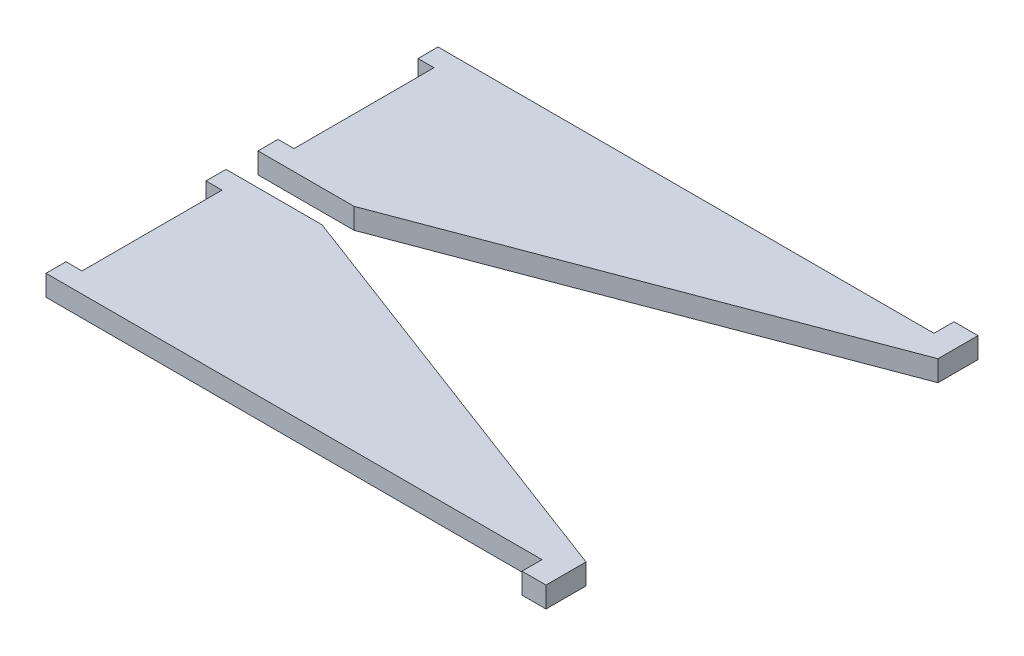
ISO-10303-21;
HEADER;
FILE_DESCRIPTION(('STEP AP214'),'2;1');
FILE_NAME('part.step','',(''),(''),'','','');
FILE_SCHEMA(('AUTOMOTIVE_DESIGN { 1 0 10303 214 1 1 1 1 }'));
ENDSEC;
DATA;
#1=APPLICATION_CONTEXT('core data for automotive mechanical design processes');
#2=APPLICATION_PROTOCOL_DEFINITION('international standard','automotive_design',2000,#1);
#3=PRODUCT_CONTEXT('',#1,'mechanical');
#4=PRODUCT('Part','Part','',(#3));
#5=PRODUCT_RELATED_PRODUCT_CATEGORY('part','',(#4));
#6=PRODUCT_DEFINITION_FORMATION('','',#4);
#7=PRODUCT_DEFINITION_CONTEXT('part definition',#1,'design');
#8=PRODUCT_DEFINITION('design','',#6,#7);
#9=PRODUCT_DEFINITION_SHAPE('','',#8);
#10=(LENGTH_UNIT() NAMED_UNIT(*) SI_UNIT(.MILLI.,.METRE.));
#11=(NAMED_UNIT(*) PLANE_ANGLE_UNIT() SI_UNIT($,.RADIAN.));
#12=(NAMED_UNIT(*) SI_UNIT($,.STERADIAN.) SOLID_ANGLE_UNIT());
#13=UNCERTAINTY_MEASURE_WITH_UNIT(LENGTH_MEASURE(1.E-05),#10,'distance_accuracy_value','');
#14=(GEOMETRIC_REPRESENTATION_CONTEXT(3) GLOBAL_UNCERTAINTY_ASSIGNED_CONTEXT((#13)) GLOBAL_UNIT_ASSIGNED_CONTEXT((#10,
#11,#12)) REPRESENTATION_CONTEXT('',''));
#15=CARTESIAN_POINT('',(0.,0.,0.));
#16=DIRECTION('',(0.,0.,1.));
#17=DIRECTION('',(1.,0.,0.));
#18=AXIS2_PLACEMENT_3D('',#15,#16,#17);
#19=CARTESIAN_POINT('',(0.,6.604,67.31));
#20=DIRECTION('',(1.,0.,0.));
#21=DIRECTION('',(0.,0.,-1.));
#22=AXIS2_PLACEMENT_3D('',#19,#20,#21);
#23=PLANE('',#22);
#24=DIRECTION('',(0.,0.,1.));
#25=VECTOR('',#24,1.);
#26=CARTESIAN_POINT('',(0.,0.,67.31));
#27=LINE('',#26,#25);
#28=CARTESIAN_POINT('',(0.,0.,67.31));
#29=VERTEX_POINT('',#28);
#30=CARTESIAN_POINT('',(0.,0.,73.66));
#31=VERTEX_POINT('',#30);
#32=EDGE_CURVE('E163',#29,#31,#27,.T.);
#33=ORIENTED_EDGE('',*,*,#32,.T.);
#34=DIRECTION('',(0.,-1.,0.));
#35=VECTOR('',#34,1.);
#36=CARTESIAN_POINT('',(0.,6.604,73.66));
#37=LINE('',#36,#35);
#38=CARTESIAN_POINT('',(0.,6.604,73.66));
#39=VERTEX_POINT('',#38);
#40=EDGE_CURVE('E12',#39,#31,#37,.T.);
#41=ORIENTED_EDGE('',*,*,#40,.F.);
#42=DIRECTION('',(0.,0.,1.));
#43=VECTOR('',#42,1.);
#44=CARTESIAN_POINT('',(0.,6.604,67.31));
#45=LINE('',#44,#43);
#46=CARTESIAN_POINT('',(0.,6.604,67.31));
#47=VERTEX_POINT('',#46);
#48=EDGE_CURVE('E183',#47,#39,#45,.T.);
#49=ORIENTED_EDGE('',*,*,#48,.F.);
#50=DIRECTION('',(0.,-1.,0.));
#51=VECTOR('',#50,1.);
#52=CARTESIAN_POINT('',(0.,6.604,67.31));
#53=LINE('',#52,#51);
#54=EDGE_CURVE('E159',#47,#29,#53,.T.);
#55=ORIENTED_EDGE('',*,*,#54,.T.);
#56=EDGE_LOOP('',(#33,#41,#49,#55));
#57=FACE_BOUND('',#56,.T.);
#58=ADVANCED_FACE('F49',(#57),#23,.F.);
#59=CARTESIAN_POINT('',(0.,6.604,73.66));
#60=DIRECTION('',(0.,0.,-1.));
#61=DIRECTION('',(-1.,0.,0.));
#62=AXIS2_PLACEMENT_3D('',#59,#60,#61);
#63=PLANE('',#62);
#64=DIRECTION('',(1.,0.,0.));
#65=VECTOR('',#64,1.);
#66=CARTESIAN_POINT('',(0.,0.,73.66));
#67=LINE('',#66,#65);
#68=CARTESIAN_POINT('',(5.08,0.,73.66));
#69=VERTEX_POINT('',#68);
#70=EDGE_CURVE('E166',#31,#69,#67,.T.);
#71=ORIENTED_EDGE('',*,*,#70,.T.);
#72=DIRECTION('',(0.,-1.,0.));
#73=VECTOR('',#72,1.);
#74=CARTESIAN_POINT('',(5.08,6.604,73.66));
#75=LINE('',#74,#73);
#76=CARTESIAN_POINT('',(5.08,6.604,73.66));
#77=VERTEX_POINT('',#76);
#78=EDGE_CURVE('E57',#77,#69,#75,.T.);
#79=ORIENTED_EDGE('',*,*,#78,.F.);
#80=DIRECTION('',(1.,0.,0.));
#81=VECTOR('',#80,1.);
#82=CARTESIAN_POINT('',(0.,6.604,73.66));
#83=LINE('',#82,#81);
#84=EDGE_CURVE('E117',#39,#77,#83,.T.);
#85=ORIENTED_EDGE('',*,*,#84,.F.);
#86=ORIENTED_EDGE('',*,*,#40,.T.);
#87=EDGE_LOOP('',(#71,#79,#85,#86));
#88=FACE_BOUND('',#87,.T.);
#89=ADVANCED_FACE('F255',(#88),#63,.F.);
#90=CARTESIAN_POINT('',(5.08,6.604,73.66));
#91=DIRECTION('',(1.,0.,0.));
#92=DIRECTION('',(0.,0.,-1.));
#93=AXIS2_PLACEMENT_3D('',#90,#91,#92);
#94=PLANE('',#93);
#95=DIRECTION('',(0.,0.,1.));
#96=VECTOR('',#95,1.);
#97=CARTESIAN_POINT('',(5.08,0.,73.66));
#98=LINE('',#97,#96);
#99=CARTESIAN_POINT('',(5.08,0.,118.11));
#100=VERTEX_POINT('',#99);
#101=EDGE_CURVE('E168',#69,#100,#98,.T.);
#102=ORIENTED_EDGE('',*,*,#101,.T.);
#103=DIRECTION('',(0.,-1.,0.));
#104=VECTOR('',#103,1.);
#105=CARTESIAN_POINT('',(5.08,6.604,118.11));
#106=LINE('',#105,#104);
#107=CARTESIAN_POINT('',(5.08,6.604,118.11));
#108=VERTEX_POINT('',#107);
#109=EDGE_CURVE('E199',#108,#100,#106,.T.);
#110=ORIENTED_EDGE('',*,*,#109,.F.);
#111=DIRECTION('',(0.,0.,1.));
#112=VECTOR('',#111,1.);
#113=CARTESIAN_POINT('',(5.08,6.604,73.66));
#114=LINE('',#113,#112);
#115=EDGE_CURVE('E207',#77,#108,#114,.T.);
#116=ORIENTED_EDGE('',*,*,#115,.F.);
#117=ORIENTED_EDGE('',*,*,#78,.T.);
#118=EDGE_LOOP('',(#102,#110,#116,#117));
#119=FACE_BOUND('',#118,.T.);
#120=ADVANCED_FACE('F205',(#119),#94,.F.);
#121=CARTESIAN_POINT('',(0.,6.604,118.11));
#122=DIRECTION('',(0.,0.,1.));
#123=DIRECTION('',(1.,0.,0.));
#124=AXIS2_PLACEMENT_3D('',#121,#122,#123);
#125=PLANE('',#124);
#126=DIRECTION('',(-1.,0.,0.));
#127=VECTOR('',#126,1.);
#128=CARTESIAN_POINT('',(0.,0.,118.11));
#129=LINE('',#128,#127);
#130=CARTESIAN_POINT('',(0.,0.,118.11));
#131=VERTEX_POINT('',#130);
#132=EDGE_CURVE('E170',#100,#131,#129,.T.);
#133=ORIENTED_EDGE('',*,*,#132,.T.);
#134=DIRECTION('',(0.,-1.,0.));
#135=VECTOR('',#134,1.);
#136=CARTESIAN_POINT('',(0.,6.604,118.11));
#137=LINE('',#136,#135);
#138=CARTESIAN_POINT('',(0.,6.604,118.11));
#139=VERTEX_POINT('',#138);
#140=EDGE_CURVE('E196',#139,#131,#137,.T.);
#141=ORIENTED_EDGE('',*,*,#140,.F.);
#142=DIRECTION('',(-1.,0.,0.));
#143=VECTOR('',#142,1.);
#144=CARTESIAN_POINT('',(0.,6.604,118.11));
#145=LINE('',#144,#143);
#146=EDGE_CURVE('E225',#108,#139,#145,.T.);
#147=ORIENTED_EDGE('',*,*,#146,.F.);
#148=ORIENTED_EDGE('',*,*,#109,.T.);
#149=EDGE_LOOP('',(#133,#141,#147,#148));
#150=FACE_BOUND('',#149,.T.);
#151=ADVANCED_FACE('F216',(#150),#125,.F.);
#152=CARTESIAN_POINT('',(0.,6.604,124.46));
#153=DIRECTION('',(1.,0.,0.));
#154=DIRECTION('',(0.,0.,-1.));
#155=AXIS2_PLACEMENT_3D('',#152,#153,#154);
#156=PLANE('',#155);
#157=DIRECTION('',(0.,0.,1.));
#158=VECTOR('',#157,1.);
#159=CARTESIAN_POINT('',(0.,0.,124.46));
#160=LINE('',#159,#158);
#161=CARTESIAN_POINT('',(0.,0.,124.46));
#162=VERTEX_POINT('',#161);
#163=EDGE_CURVE('E172',#131,#162,#160,.T.);
#164=ORIENTED_EDGE('',*,*,#163,.T.);
#165=DIRECTION('',(0.,-1.,0.));
#166=VECTOR('',#165,1.);
#167=CARTESIAN_POINT('',(0.,6.604,124.46));
#168=LINE('',#167,#166);
#169=CARTESIAN_POINT('',(0.,6.604,124.46));
#170=VERTEX_POINT('',#169);
#171=EDGE_CURVE('E193',#170,#162,#168,.T.);
#172=ORIENTED_EDGE('',*,*,#171,.F.);
#173=DIRECTION('',(0.,0.,1.));
#174=VECTOR('',#173,1.);
#175=CARTESIAN_POINT('',(0.,6.604,124.46));
#176=LINE('',#175,#174);
#177=EDGE_CURVE('E222',#139,#170,#176,.T.);
#178=ORIENTED_EDGE('',*,*,#177,.F.);
#179=ORIENTED_EDGE('',*,*,#140,.T.);
#180=EDGE_LOOP('',(#164,#172,#178,#179));
#181=FACE_BOUND('',#180,.T.);
#182=ADVANCED_FACE('F220',(#181),#156,.F.);
#183=CARTESIAN_POINT('',(0.,6.604,124.46));
#184=DIRECTION('',(0.,0.,-1.));
#185=DIRECTION('',(-1.,0.,0.));
#186=AXIS2_PLACEMENT_3D('',#183,#184,#185);
#187=PLANE('',#186);
#188=DIRECTION('',(1.,0.,0.));
#189=VECTOR('',#188,1.);
#190=CARTESIAN_POINT('',(0.,0.,124.46));
#191=LINE('',#190,#189);
#192=CARTESIAN_POINT('',(157.48,0.,124.46));
#193=VERTEX_POINT('',#192);
#194=EDGE_CURVE('E174',#162,#193,#191,.T.);
#195=ORIENTED_EDGE('',*,*,#194,.T.);
#196=DIRECTION('',(0.,-1.,0.));
#197=VECTOR('',#196,1.);
#198=CARTESIAN_POINT('',(157.48,6.604,124.46));
#199=LINE('',#198,#197);
#200=CARTESIAN_POINT('',(157.48,6.604,124.46));
#201=VERTEX_POINT('',#200);
#202=EDGE_CURVE('E190',#201,#193,#199,.T.);
#203=ORIENTED_EDGE('',*,*,#202,.F.);
#204=DIRECTION('',(1.,0.,0.));
#205=VECTOR('',#204,1.);
#206=CARTESIAN_POINT('',(0.,6.604,124.46));
#207=LINE('',#206,#205);
#208=EDGE_CURVE('E224',#170,#201,#207,.T.);
#209=ORIENTED_EDGE('',*,*,#208,.F.);
#210=ORIENTED_EDGE('',*,*,#171,.T.);
#211=EDGE_LOOP('',(#195,#203,#209,#210));
#212=FACE_BOUND('',#211,.T.);
#213=ADVANCED_FACE('F268',(#212),#187,.F.);
#214=CARTESIAN_POINT('',(157.48,6.604,124.46));
#215=DIRECTION('',(1.,0.,0.));
#216=DIRECTION('',(0.,0.,-1.));
#217=AXIS2_PLACEMENT_3D('',#214,#215,#216);
#218=PLANE('',#217);
#219=DIRECTION('',(0.,0.,1.));
#220=VECTOR('',#219,1.);
#221=CARTESIAN_POINT('',(157.48,0.,124.46));
#222=LINE('',#221,#220);
#223=CARTESIAN_POINT('',(157.48,0.,130.81));
#224=VERTEX_POINT('',#223);
#225=EDGE_CURVE('E176',#193,#224,#222,.T.);
#226=ORIENTED_EDGE('',*,*,#225,.T.);
#227=DIRECTION('',(0.,-1.,0.));
#228=VECTOR('',#227,1.);
#229=CARTESIAN_POINT('',(157.48,6.604,130.81));
#230=LINE('',#229,#228);
#231=CARTESIAN_POINT('',(157.48,6.604,130.81));
#232=VERTEX_POINT('',#231);
#233=EDGE_CURVE('E187',#232,#224,#230,.T.);
#234=ORIENTED_EDGE('',*,*,#233,.F.);
#235=DIRECTION('',(0.,0.,1.));
#236=VECTOR('',#235,1.);
#237=CARTESIAN_POINT('',(157.48,6.604,124.46));
#238=LINE('',#237,#236);
#239=EDGE_CURVE('E227',#201,#232,#238,.T.);
#240=ORIENTED_EDGE('',*,*,#239,.F.);
#241=ORIENTED_EDGE('',*,*,#202,.T.);
#242=EDGE_LOOP('',(#226,#234,#240,#241));
#243=FACE_BOUND('',#242,.T.);
#244=ADVANCED_FACE('F236',(#243),#218,.F.);
#245=CARTESIAN_POINT('',(157.48,6.604,130.81));
#246=DIRECTION('',(0.,0.,-1.));
#247=DIRECTION('',(-1.,0.,0.));
#248=AXIS2_PLACEMENT_3D('',#245,#246,#247);
#249=PLANE('',#248);
#250=DIRECTION('',(1.,0.,0.));
#251=VECTOR('',#250,1.);
#252=CARTESIAN_POINT('',(157.48,0.,130.81));
#253=LINE('',#252,#251);
#254=CARTESIAN_POINT('',(165.1,0.,130.81));
#255=VERTEX_POINT('',#254);
#256=EDGE_CURVE('E178',#224,#255,#253,.T.);
#257=ORIENTED_EDGE('',*,*,#256,.T.);
#258=DIRECTION('',(0.,-1.,0.));
#259=VECTOR('',#258,1.);
#260=CARTESIAN_POINT('',(165.1,6.604,130.81));
#261=LINE('',#260,#259);
#262=CARTESIAN_POINT('',(165.1,6.604,130.81));
#263=VERTEX_POINT('',#262);
#264=EDGE_CURVE('E154',#263,#255,#261,.T.);
#265=ORIENTED_EDGE('',*,*,#264,.F.);
#266=DIRECTION('',(1.,0.,0.));
#267=VECTOR('',#266,1.);
#268=CARTESIAN_POINT('',(157.48,6.604,130.81));
#269=LINE('',#268,#267);
#270=EDGE_CURVE('E145',#232,#263,#269,.T.);
#271=ORIENTED_EDGE('',*,*,#270,.F.);
#272=ORIENTED_EDGE('',*,*,#233,.T.);
#273=EDGE_LOOP('',(#257,#265,#271,#272));
#274=FACE_BOUND('',#273,.T.);
#275=ADVANCED_FACE('F240',(#274),#249,.F.);
#276=CARTESIAN_POINT('',(165.1,6.604,130.81));
#277=DIRECTION('',(-1.,0.,0.));
#278=DIRECTION('',(0.,0.,1.));
#279=AXIS2_PLACEMENT_3D('',#276,#277,#278);
#280=PLANE('',#279);
#281=DIRECTION('',(0.,0.,-1.));
#282=VECTOR('',#281,1.);
#283=CARTESIAN_POINT('',(165.1,0.,130.81));
#284=LINE('',#283,#282);
#285=CARTESIAN_POINT('',(165.1,0.,118.11));
#286=VERTEX_POINT('',#285);
#287=EDGE_CURVE('E153',#255,#286,#284,.T.);
#288=ORIENTED_EDGE('',*,*,#287,.T.);
#289=DIRECTION('',(0.,-1.,0.));
#290=VECTOR('',#289,1.);
#291=CARTESIAN_POINT('',(165.1,6.604,118.11));
#292=LINE('',#291,#290);
#293=CARTESIAN_POINT('',(165.1,6.604,118.11));
#294=VERTEX_POINT('',#293);
#295=EDGE_CURVE('E150',#294,#286,#292,.T.);
#296=ORIENTED_EDGE('',*,*,#295,.F.);
#297=DIRECTION('',(0.,0.,-1.));
#298=VECTOR('',#297,1.);
#299=CARTESIAN_POINT('',(165.1,6.604,130.81));
#300=LINE('',#299,#298);
#301=EDGE_CURVE('E139',#263,#294,#300,.T.);
#302=ORIENTED_EDGE('',*,*,#301,.F.);
#303=ORIENTED_EDGE('',*,*,#264,.T.);
#304=EDGE_LOOP('',(#288,#296,#302,#303));
#305=FACE_BOUND('',#304,.T.);
#306=ADVANCED_FACE('F151',(#305),#280,.F.);
#307=CARTESIAN_POINT('',(165.1,6.604,118.11));
#308=DIRECTION('',(-0.353057252434242,0.,0.935601718950742));
#309=DIRECTION('',(0.935601718950742,0.,0.353057252434242));
#310=AXIS2_PLACEMENT_3D('',#307,#308,#309);
#311=PLANE('',#310);
#312=DIRECTION('',(-0.935601718950742,0.,-0.353057252434242));
#313=VECTOR('',#312,1.);
#314=CARTESIAN_POINT('',(165.1,0.,118.11));
#315=LINE('',#314,#313);
#316=CARTESIAN_POINT('',(30.48,0.,67.31));
#317=VERTEX_POINT('',#316);
#318=EDGE_CURVE('E103',#286,#317,#315,.T.);
#319=ORIENTED_EDGE('',*,*,#318,.T.);
#320=DIRECTION('',(0.,-1.,0.));
#321=VECTOR('',#320,1.);
#322=CARTESIAN_POINT('',(30.48,6.604,67.31));
#323=LINE('',#322,#321);
#324=CARTESIAN_POINT('',(30.48,6.604,67.31));
#325=VERTEX_POINT('',#324);
#326=EDGE_CURVE('E155',#325,#317,#323,.T.);
#327=ORIENTED_EDGE('',*,*,#326,.F.);
#328=DIRECTION('',(-0.935601718950742,0.,-0.353057252434242));
#329=VECTOR('',#328,1.);
#330=CARTESIAN_POINT('',(165.1,6.604,118.11));
#331=LINE('',#330,#329);
#332=EDGE_CURVE('E143',#294,#325,#331,.T.);
#333=ORIENTED_EDGE('',*,*,#332,.F.);
#334=ORIENTED_EDGE('',*,*,#295,.T.);
#335=EDGE_LOOP('',(#319,#327,#333,#334));
#336=FACE_BOUND('',#335,.T.);
#337=ADVANCED_FACE('F157',(#336),#311,.F.);
#338=CARTESIAN_POINT('',(30.48,6.604,67.31));
#339=DIRECTION('',(0.,0.,1.));
#340=DIRECTION('',(1.,0.,0.));
#341=AXIS2_PLACEMENT_3D('',#338,#339,#340);
#342=PLANE('',#341);
#343=DIRECTION('',(-1.,0.,0.));
#344=VECTOR('',#343,1.);
#345=CARTESIAN_POINT('',(30.48,0.,67.31));
#346=LINE('',#345,#344);
#347=EDGE_CURVE('E109',#317,#29,#346,.T.);
#348=ORIENTED_EDGE('',*,*,#347,.T.);
#349=ORIENTED_EDGE('',*,*,#54,.F.);
#350=DIRECTION('',(-1.,0.,0.));
#351=VECTOR('',#350,1.);
#352=CARTESIAN_POINT('',(30.48,6.604,67.31));
#353=LINE('',#352,#351);
#354=EDGE_CURVE('E65',#325,#47,#353,.T.);
#355=ORIENTED_EDGE('',*,*,#354,.F.);
#356=ORIENTED_EDGE('',*,*,#326,.T.);
#357=EDGE_LOOP('',(#348,#349,#355,#356));
#358=FACE_BOUND('',#357,.T.);
#359=ADVANCED_FACE('F244',(#358),#342,.F.);
#360=CARTESIAN_POINT('',(0.,6.604,0.));
#361=DIRECTION('',(0.,1.,0.));
#362=DIRECTION('',(0.,0.,1.));
#363=AXIS2_PLACEMENT_3D('',#360,#361,#362);
#364=PLANE('',#363);
#365=ORIENTED_EDGE('',*,*,#48,.T.);
#366=ORIENTED_EDGE('',*,*,#84,.T.);
#367=ORIENTED_EDGE('',*,*,#115,.T.);
#368=ORIENTED_EDGE('',*,*,#146,.T.);
#369=ORIENTED_EDGE('',*,*,#177,.T.);
#370=ORIENTED_EDGE('',*,*,#208,.T.);
#371=ORIENTED_EDGE('',*,*,#239,.T.);
#372=ORIENTED_EDGE('',*,*,#270,.T.);
#373=ORIENTED_EDGE('',*,*,#301,.T.);
#374=ORIENTED_EDGE('',*,*,#332,.T.);
#375=ORIENTED_EDGE('',*,*,#354,.T.);
#376=EDGE_LOOP('',(#365,#366,#367,#368,#369,#370,#371,#372,#373,#374,#375));
#377=FACE_BOUND('',#376,.T.);
#378=ADVANCED_FACE('F141',(#377),#364,.T.);
#379=CARTESIAN_POINT('',(0.,0.,0.));
#380=DIRECTION('',(0.,1.,0.));
#381=DIRECTION('',(0.,0.,1.));
#382=AXIS2_PLACEMENT_3D('',#379,#380,#381);
#383=PLANE('',#382);
#384=ORIENTED_EDGE('',*,*,#32,.F.);
#385=ORIENTED_EDGE('',*,*,#347,.F.);
#386=ORIENTED_EDGE('',*,*,#318,.F.);
#387=ORIENTED_EDGE('',*,*,#287,.F.);
#388=ORIENTED_EDGE('',*,*,#256,.F.);
#389=ORIENTED_EDGE('',*,*,#225,.F.);
#390=ORIENTED_EDGE('',*,*,#194,.F.);
#391=ORIENTED_EDGE('',*,*,#163,.F.);
#392=ORIENTED_EDGE('',*,*,#132,.F.);
#393=ORIENTED_EDGE('',*,*,#101,.F.);
#394=ORIENTED_EDGE('',*,*,#70,.F.);
#395=EDGE_LOOP('',(#384,#385,#386,#387,#388,#389,#390,#391,#392,#393,#394));
#396=FACE_BOUND('',#395,.T.);
#397=ADVANCED_FACE('F211',(#396),#383,.F.);
#398=CLOSED_SHELL('',(#58,#89,#120,#151,#182,#213,#244,#275,#306,#337,#359,#378,#397));
#399=MANIFOLD_SOLID_BREP('B2',#398);
#400=CARTESIAN_POINT('',(0.,6.604,0.));
#401=DIRECTION('',(0.,0.,1.));
#402=DIRECTION('',(1.,0.,0.));
#403=AXIS2_PLACEMENT_3D('',#400,#401,#402);
#404=PLANE('',#403);
#405=DIRECTION('',(-1.,0.,0.));
#406=VECTOR('',#405,1.);
#407=CARTESIAN_POINT('',(0.,0.,0.));
#408=LINE('',#407,#406);
#409=CARTESIAN_POINT('',(157.48,0.,0.));
#410=VERTEX_POINT('',#409);
#411=CARTESIAN_POINT('',(0.,0.,0.));
#412=VERTEX_POINT('',#411);
#413=EDGE_CURVE('E469',#410,#412,#408,.T.);
#414=ORIENTED_EDGE('',*,*,#413,.T.);
#415=DIRECTION('',(0.,-1.,0.));
#416=VECTOR('',#415,1.);
#417=CARTESIAN_POINT('',(0.,6.604,0.));
#418=LINE('',#417,#416);
#419=CARTESIAN_POINT('',(0.,6.604,0.));
#420=VERTEX_POINT('',#419);
#421=EDGE_CURVE('E47',#420,#412,#418,.T.);
#422=ORIENTED_EDGE('',*,*,#421,.F.);
#423=DIRECTION('',(-1.,0.,0.));
#424=VECTOR('',#423,1.);
#425=CARTESIAN_POINT('',(0.,6.604,0.));
#426=LINE('',#425,#424);
#427=CARTESIAN_POINT('',(157.48,6.604,0.));
#428=VERTEX_POINT('',#427);
#429=EDGE_CURVE('E489',#428,#420,#426,.T.);
#430=ORIENTED_EDGE('',*,*,#429,.F.);
#431=DIRECTION('',(0.,-1.,0.));
#432=VECTOR('',#431,1.);
#433=CARTESIAN_POINT('',(157.48,6.604,0.));
#434=LINE('',#433,#432);
#435=EDGE_CURVE('E465',#428,#410,#434,.T.);
#436=ORIENTED_EDGE('',*,*,#435,.T.);
#437=EDGE_LOOP('',(#414,#422,#430,#436));
#438=FACE_BOUND('',#437,.T.);
#439=ADVANCED_FACE('F355',(#438),#404,.F.);
#440=CARTESIAN_POINT('',(0.,6.604,0.));
#441=DIRECTION('',(1.,0.,0.));
#442=DIRECTION('',(0.,0.,-1.));
#443=AXIS2_PLACEMENT_3D('',#440,#441,#442);
#444=PLANE('',#443);
#445=DIRECTION('',(0.,0.,1.));
#446=VECTOR('',#445,1.);
#447=CARTESIAN_POINT('',(0.,0.,0.));
#448=LINE('',#447,#446);
#449=CARTESIAN_POINT('',(0.,0.,6.35));
#450=VERTEX_POINT('',#449);
#451=EDGE_CURVE('E472',#412,#450,#448,.T.);
#452=ORIENTED_EDGE('',*,*,#451,.T.);
#453=DIRECTION('',(0.,-1.,0.));
#454=VECTOR('',#453,1.);
#455=CARTESIAN_POINT('',(0.,6.604,6.35));
#456=LINE('',#455,#454);
#457=CARTESIAN_POINT('',(0.,6.604,6.35));
#458=VERTEX_POINT('',#457);
#459=EDGE_CURVE('E363',#458,#450,#456,.T.);
#460=ORIENTED_EDGE('',*,*,#459,.F.);
#461=DIRECTION('',(0.,0.,1.));
#462=VECTOR('',#461,1.);
#463=CARTESIAN_POINT('',(0.,6.604,0.));
#464=LINE('',#463,#462);
#465=EDGE_CURVE('E423',#420,#458,#464,.T.);
#466=ORIENTED_EDGE('',*,*,#465,.F.);
#467=ORIENTED_EDGE('',*,*,#421,.T.);
#468=EDGE_LOOP('',(#452,#460,#466,#467));
#469=FACE_BOUND('',#468,.T.);
#470=ADVANCED_FACE('F561',(#469),#444,.F.);
#471=CARTESIAN_POINT('',(0.,6.604,6.35));
#472=DIRECTION('',(0.,0.,-1.));
#473=DIRECTION('',(-1.,0.,0.));
#474=AXIS2_PLACEMENT_3D('',#471,#472,#473);
#475=PLANE('',#474);
#476=DIRECTION('',(1.,0.,0.));
#477=VECTOR('',#476,1.);
#478=CARTESIAN_POINT('',(0.,0.,6.35));
#479=LINE('',#478,#477);
#480=CARTESIAN_POINT('',(5.08,0.,6.35));
#481=VERTEX_POINT('',#480);
#482=EDGE_CURVE('E474',#450,#481,#479,.T.);
#483=ORIENTED_EDGE('',*,*,#482,.T.);
#484=DIRECTION('',(0.,-1.,0.));
#485=VECTOR('',#484,1.);
#486=CARTESIAN_POINT('',(5.08,6.604,6.35));
#487=LINE('',#486,#485);
#488=CARTESIAN_POINT('',(5.08,6.604,6.35));
#489=VERTEX_POINT('',#488);
#490=EDGE_CURVE('E505',#489,#481,#487,.T.);
#491=ORIENTED_EDGE('',*,*,#490,.F.);
#492=DIRECTION('',(1.,0.,0.));
#493=VECTOR('',#492,1.);
#494=CARTESIAN_POINT('',(0.,6.604,6.35));
#495=LINE('',#494,#493);
#496=EDGE_CURVE('E513',#458,#489,#495,.T.);
#497=ORIENTED_EDGE('',*,*,#496,.F.);
#498=ORIENTED_EDGE('',*,*,#459,.T.);
#499=EDGE_LOOP('',(#483,#491,#497,#498));
#500=FACE_BOUND('',#499,.T.);
#501=ADVANCED_FACE('F511',(#500),#475,.F.);
#502=CARTESIAN_POINT('',(5.08,6.604,50.8));
#503=DIRECTION('',(1.,0.,0.));
#504=DIRECTION('',(0.,0.,-1.));
#505=AXIS2_PLACEMENT_3D('',#502,#503,#504);
#506=PLANE('',#505);
#507=DIRECTION('',(0.,0.,1.));
#508=VECTOR('',#507,1.);
#509=CARTESIAN_POINT('',(5.08,0.,50.8));
#510=LINE('',#509,#508);
#511=CARTESIAN_POINT('',(5.08,0.,50.8));
#512=VERTEX_POINT('',#511);
#513=EDGE_CURVE('E476',#481,#512,#510,.T.);
#514=ORIENTED_EDGE('',*,*,#513,.T.);
#515=DIRECTION('',(0.,-1.,0.));
#516=VECTOR('',#515,1.);
#517=CARTESIAN_POINT('',(5.08,6.604,50.8));
#518=LINE('',#517,#516);
#519=CARTESIAN_POINT('',(5.08,6.604,50.8));
#520=VERTEX_POINT('',#519);
#521=EDGE_CURVE('E502',#520,#512,#518,.T.);
#522=ORIENTED_EDGE('',*,*,#521,.F.);
#523=DIRECTION('',(0.,0.,1.));
#524=VECTOR('',#523,1.);
#525=CARTESIAN_POINT('',(5.08,6.604,50.8));
#526=LINE('',#525,#524);
#527=EDGE_CURVE('E531',#489,#520,#526,.T.);
#528=ORIENTED_EDGE('',*,*,#527,.F.);
#529=ORIENTED_EDGE('',*,*,#490,.T.);
#530=EDGE_LOOP('',(#514,#522,#528,#529));
#531=FACE_BOUND('',#530,.T.);
#532=ADVANCED_FACE('F522',(#531),#506,.F.);
#533=CARTESIAN_POINT('',(0.,6.604,50.8));
#534=DIRECTION('',(0.,0.,1.));
#535=DIRECTION('',(1.,0.,0.));
#536=AXIS2_PLACEMENT_3D('',#533,#534,#535);
#537=PLANE('',#536);
#538=DIRECTION('',(-1.,0.,0.));
#539=VECTOR('',#538,1.);
#540=CARTESIAN_POINT('',(0.,0.,50.8));
#541=LINE('',#540,#539);
#542=CARTESIAN_POINT('',(0.,0.,50.8));
#543=VERTEX_POINT('',#542);
#544=EDGE_CURVE('E478',#512,#543,#541,.T.);
#545=ORIENTED_EDGE('',*,*,#544,.T.);
#546=DIRECTION('',(0.,-1.,0.));
#547=VECTOR('',#546,1.);
#548=CARTESIAN_POINT('',(0.,6.604,50.8));
#549=LINE('',#548,#547);
#550=CARTESIAN_POINT('',(0.,6.604,50.8));
#551=VERTEX_POINT('',#550);
#552=EDGE_CURVE('E499',#551,#543,#549,.T.);
#553=ORIENTED_EDGE('',*,*,#552,.F.);
#554=DIRECTION('',(-1.,0.,0.));
#555=VECTOR('',#554,1.);
#556=CARTESIAN_POINT('',(0.,6.604,50.8));
#557=LINE('',#556,#555);
#558=EDGE_CURVE('E528',#520,#551,#557,.T.);
#559=ORIENTED_EDGE('',*,*,#558,.F.);
#560=ORIENTED_EDGE('',*,*,#521,.T.);
#561=EDGE_LOOP('',(#545,#553,#559,#560));
#562=FACE_BOUND('',#561,.T.);
#563=ADVANCED_FACE('F526',(#562),#537,.F.);
#564=CARTESIAN_POINT('',(0.,6.604,57.15));
#565=DIRECTION('',(1.,0.,0.));
#566=DIRECTION('',(0.,0.,-1.));
#567=AXIS2_PLACEMENT_3D('',#564,#565,#566);
#568=PLANE('',#567);
#569=DIRECTION('',(0.,0.,1.));
#570=VECTOR('',#569,1.);
#571=CARTESIAN_POINT('',(0.,0.,57.15));
#572=LINE('',#571,#570);
#573=CARTESIAN_POINT('',(0.,0.,57.15));
#574=VERTEX_POINT('',#573);
#575=EDGE_CURVE('E480',#543,#574,#572,.T.);
#576=ORIENTED_EDGE('',*,*,#575,.T.);
#577=DIRECTION('',(0.,-1.,0.));
#578=VECTOR('',#577,1.);
#579=CARTESIAN_POINT('',(0.,6.604,57.15));
#580=LINE('',#579,#578);
#581=CARTESIAN_POINT('',(0.,6.604,57.15));
#582=VERTEX_POINT('',#581);
#583=EDGE_CURVE('E496',#582,#574,#580,.T.);
#584=ORIENTED_EDGE('',*,*,#583,.F.);
#585=DIRECTION('',(0.,0.,1.));
#586=VECTOR('',#585,1.);
#587=CARTESIAN_POINT('',(0.,6.604,57.15));
#588=LINE('',#587,#586);
#589=EDGE_CURVE('E530',#551,#582,#588,.T.);
#590=ORIENTED_EDGE('',*,*,#589,.F.);
#591=ORIENTED_EDGE('',*,*,#552,.T.);
#592=EDGE_LOOP('',(#576,#584,#590,#591));
#593=FACE_BOUND('',#592,.T.);
#594=ADVANCED_FACE('F574',(#593),#568,.F.);
#595=CARTESIAN_POINT('',(30.48,6.604,57.15));
#596=DIRECTION('',(0.,0.,-1.));
#597=DIRECTION('',(-1.,0.,0.));
#598=AXIS2_PLACEMENT_3D('',#595,#596,#597);
#599=PLANE('',#598);
#600=DIRECTION('',(1.,0.,0.));
#601=VECTOR('',#600,1.);
#602=CARTESIAN_POINT('',(30.48,0.,57.15));
#603=LINE('',#602,#601);
#604=CARTESIAN_POINT('',(30.48,0.,57.15));
#605=VERTEX_POINT('',#604);
#606=EDGE_CURVE('E482',#574,#605,#603,.T.);
#607=ORIENTED_EDGE('',*,*,#606,.T.);
#608=DIRECTION('',(0.,-1.,0.));
#609=VECTOR('',#608,1.);
#610=CARTESIAN_POINT('',(30.48,6.604,57.15));
#611=LINE('',#610,#609);
#612=CARTESIAN_POINT('',(30.48,6.604,57.15));
#613=VERTEX_POINT('',#612);
#614=EDGE_CURVE('E493',#613,#605,#611,.T.);
#615=ORIENTED_EDGE('',*,*,#614,.F.);
#616=DIRECTION('',(1.,0.,0.));
#617=VECTOR('',#616,1.);
#618=CARTESIAN_POINT('',(30.48,6.604,57.15));
#619=LINE('',#618,#617);
#620=EDGE_CURVE('E533',#582,#613,#619,.T.);
#621=ORIENTED_EDGE('',*,*,#620,.F.);
#622=ORIENTED_EDGE('',*,*,#583,.T.);
#623=EDGE_LOOP('',(#607,#615,#621,#622));
#624=FACE_BOUND('',#623,.T.);
#625=ADVANCED_FACE('F542',(#624),#599,.F.);
#626=CARTESIAN_POINT('',(165.1,6.604,6.35));
#627=DIRECTION('',(-0.353057252434242,0.,-0.935601718950742));
#628=DIRECTION('',(-0.935601718950742,0.,0.353057252434242));
#629=AXIS2_PLACEMENT_3D('',#626,#627,#628);
#630=PLANE('',#629);
#631=DIRECTION('',(0.935601718950742,0.,-0.353057252434242));
#632=VECTOR('',#631,1.);
#633=CARTESIAN_POINT('',(165.1,0.,6.35));
#634=LINE('',#633,#632);
#635=CARTESIAN_POINT('',(165.1,0.,6.35));
#636=VERTEX_POINT('',#635);
#637=EDGE_CURVE('E484',#605,#636,#634,.T.);
#638=ORIENTED_EDGE('',*,*,#637,.T.);
#639=DIRECTION('',(0.,-1.,0.));
#640=VECTOR('',#639,1.);
#641=CARTESIAN_POINT('',(165.1,6.604,6.35));
#642=LINE('',#641,#640);
#643=CARTESIAN_POINT('',(165.1,6.604,6.35));
#644=VERTEX_POINT('',#643);
#645=EDGE_CURVE('E460',#644,#636,#642,.T.);
#646=ORIENTED_EDGE('',*,*,#645,.F.);
#647=DIRECTION('',(0.935601718950742,0.,-0.353057252434242));
#648=VECTOR('',#647,1.);
#649=CARTESIAN_POINT('',(165.1,6.604,6.35));
#650=LINE('',#649,#648);
#651=EDGE_CURVE('E451',#613,#644,#650,.T.);
#652=ORIENTED_EDGE('',*,*,#651,.F.);
#653=ORIENTED_EDGE('',*,*,#614,.T.);
#654=EDGE_LOOP('',(#638,#646,#652,#653));
#655=FACE_BOUND('',#654,.T.);
#656=ADVANCED_FACE('F546',(#655),#630,.F.);
#657=CARTESIAN_POINT('',(165.1,6.604,-6.35));
#658=DIRECTION('',(-1.,0.,0.));
#659=DIRECTION('',(0.,0.,1.));
#660=AXIS2_PLACEMENT_3D('',#657,#658,#659);
#661=PLANE('',#660);
#662=DIRECTION('',(0.,0.,-1.));
#663=VECTOR('',#662,1.);
#664=CARTESIAN_POINT('',(165.1,0.,-6.35));
#665=LINE('',#664,#663);
#666=CARTESIAN_POINT('',(165.1,0.,-6.35));
#667=VERTEX_POINT('',#666);
#668=EDGE_CURVE('E459',#636,#667,#665,.T.);
#669=ORIENTED_EDGE('',*,*,#668,.T.);
#670=DIRECTION('',(0.,-1.,0.));
#671=VECTOR('',#670,1.);
#672=CARTESIAN_POINT('',(165.1,6.604,-6.35));
#673=LINE('',#672,#671);
#674=CARTESIAN_POINT('',(165.1,6.604,-6.35));
#675=VERTEX_POINT('',#674);
#676=EDGE_CURVE('E456',#675,#667,#673,.T.);
#677=ORIENTED_EDGE('',*,*,#676,.F.);
#678=DIRECTION('',(0.,0.,-1.));
#679=VECTOR('',#678,1.);
#680=CARTESIAN_POINT('',(165.1,6.604,-6.35));
#681=LINE('',#680,#679);
#682=EDGE_CURVE('E445',#644,#675,#681,.T.);
#683=ORIENTED_EDGE('',*,*,#682,.F.);
#684=ORIENTED_EDGE('',*,*,#645,.T.);
#685=EDGE_LOOP('',(#669,#677,#683,#684));
#686=FACE_BOUND('',#685,.T.);
#687=ADVANCED_FACE('F457',(#686),#661,.F.);
#688=CARTESIAN_POINT('',(157.48,6.604,-6.35));
#689=DIRECTION('',(0.,0.,1.));
#690=DIRECTION('',(1.,0.,0.));
#691=AXIS2_PLACEMENT_3D('',#688,#689,#690);
#692=PLANE('',#691);
#693=DIRECTION('',(-1.,0.,0.));
#694=VECTOR('',#693,1.);
#695=CARTESIAN_POINT('',(157.48,0.,-6.35));
#696=LINE('',#695,#694);
#697=CARTESIAN_POINT('',(157.48,0.,-6.35));
#698=VERTEX_POINT('',#697);
#699=EDGE_CURVE('E409',#667,#698,#696,.T.);
#700=ORIENTED_EDGE('',*,*,#699,.T.);
#701=DIRECTION('',(0.,-1.,0.));
#702=VECTOR('',#701,1.);
#703=CARTESIAN_POINT('',(157.48,6.604,-6.35));
#704=LINE('',#703,#702);
#705=CARTESIAN_POINT('',(157.48,6.604,-6.35));
#706=VERTEX_POINT('',#705);
#707=EDGE_CURVE('E461',#706,#698,#704,.T.);
#708=ORIENTED_EDGE('',*,*,#707,.F.);
#709=DIRECTION('',(-1.,0.,0.));
#710=VECTOR('',#709,1.);
#711=CARTESIAN_POINT('',(157.48,6.604,-6.35));
#712=LINE('',#711,#710);
#713=EDGE_CURVE('E449',#675,#706,#712,.T.);
#714=ORIENTED_EDGE('',*,*,#713,.F.);
#715=ORIENTED_EDGE('',*,*,#676,.T.);
#716=EDGE_LOOP('',(#700,#708,#714,#715));
#717=FACE_BOUND('',#716,.T.);
#718=ADVANCED_FACE('F463',(#717),#692,.F.);
#719=CARTESIAN_POINT('',(157.48,6.604,0.));
#720=DIRECTION('',(1.,0.,0.));
#721=DIRECTION('',(0.,0.,-1.));
#722=AXIS2_PLACEMENT_3D('',#719,#720,#721);
#723=PLANE('',#722);
#724=DIRECTION('',(0.,0.,1.));
#725=VECTOR('',#724,1.);
#726=CARTESIAN_POINT('',(157.48,0.,0.));
#727=LINE('',#726,#725);
#728=EDGE_CURVE('E415',#698,#410,#727,.T.);
#729=ORIENTED_EDGE('',*,*,#728,.T.);
#730=ORIENTED_EDGE('',*,*,#435,.F.);
#731=DIRECTION('',(0.,0.,1.));
#732=VECTOR('',#731,1.);
#733=CARTESIAN_POINT('',(157.48,6.604,0.));
#734=LINE('',#733,#732);
#735=EDGE_CURVE('E371',#706,#428,#734,.T.);
#736=ORIENTED_EDGE('',*,*,#735,.F.);
#737=ORIENTED_EDGE('',*,*,#707,.T.);
#738=EDGE_LOOP('',(#729,#730,#736,#737));
#739=FACE_BOUND('',#738,.T.);
#740=ADVANCED_FACE('F550',(#739),#723,.F.);
#741=CARTESIAN_POINT('',(0.,6.604,0.));
#742=DIRECTION('',(0.,1.,0.));
#743=DIRECTION('',(0.,0.,1.));
#744=AXIS2_PLACEMENT_3D('',#741,#742,#743);
#745=PLANE('',#744);
#746=ORIENTED_EDGE('',*,*,#429,.T.);
#747=ORIENTED_EDGE('',*,*,#465,.T.);
#748=ORIENTED_EDGE('',*,*,#496,.T.);
#749=ORIENTED_EDGE('',*,*,#527,.T.);
#750=ORIENTED_EDGE('',*,*,#558,.T.);
#751=ORIENTED_EDGE('',*,*,#589,.T.);
#752=ORIENTED_EDGE('',*,*,#620,.T.);
#753=ORIENTED_EDGE('',*,*,#651,.T.);
#754=ORIENTED_EDGE('',*,*,#682,.T.);
#755=ORIENTED_EDGE('',*,*,#713,.T.);
#756=ORIENTED_EDGE('',*,*,#735,.T.);
#757=EDGE_LOOP('',(#746,#747,#748,#749,#750,#751,#752,#753,#754,#755,#756));
#758=FACE_BOUND('',#757,.T.);
#759=ADVANCED_FACE('F447',(#758),#745,.T.);
#760=CARTESIAN_POINT('',(0.,0.,0.));
#761=DIRECTION('',(0.,1.,0.));
#762=DIRECTION('',(0.,0.,1.));
#763=AXIS2_PLACEMENT_3D('',#760,#761,#762);
#764=PLANE('',#763);
#765=ORIENTED_EDGE('',*,*,#413,.F.);
#766=ORIENTED_EDGE('',*,*,#728,.F.);
#767=ORIENTED_EDGE('',*,*,#699,.F.);
#768=ORIENTED_EDGE('',*,*,#668,.F.);
#769=ORIENTED_EDGE('',*,*,#637,.F.);
#770=ORIENTED_EDGE('',*,*,#606,.F.);
#771=ORIENTED_EDGE('',*,*,#575,.F.);
#772=ORIENTED_EDGE('',*,*,#544,.F.);
#773=ORIENTED_EDGE('',*,*,#513,.F.);
#774=ORIENTED_EDGE('',*,*,#482,.F.);
#775=ORIENTED_EDGE('',*,*,#451,.F.);
#776=EDGE_LOOP('',(#765,#766,#767,#768,#769,#770,#771,#772,#773,#774,#775));
#777=FACE_BOUND('',#776,.T.);
#778=ADVANCED_FACE('F517',(#777),#764,.F.);
#779=CLOSED_SHELL('',(#439,#470,#501,#532,#563,#594,#625,#656,#687,#718,#740,#759,#778));
#780=MANIFOLD_SOLID_BREP('B6',#779);
#781=ADVANCED_BREP_SHAPE_REPRESENTATION('',(#18,#399,#780),#14);
#782=SHAPE_DEFINITION_REPRESENTATION(#9,#781);
ENDSEC;
END-ISO-10303-21;
